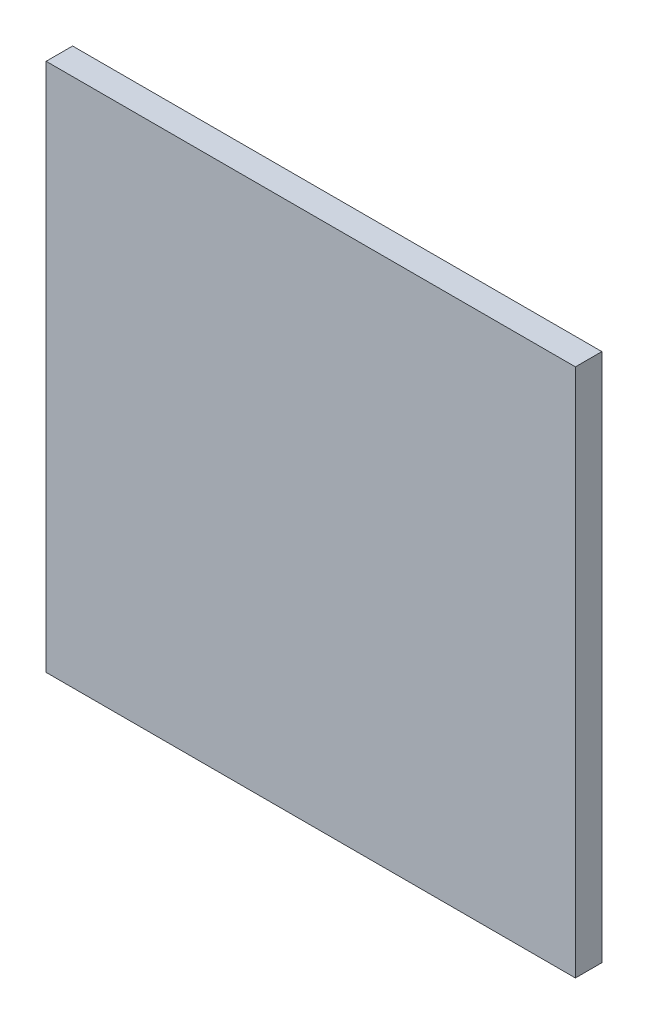
ISO-10303-21;
HEADER;
FILE_DESCRIPTION(('STEP AP214'),'2;1');
FILE_NAME('part.step','',(''),(''),'','','');
FILE_SCHEMA(('AUTOMOTIVE_DESIGN { 1 0 10303 214 1 1 1 1 }'));
ENDSEC;
DATA;
#1=APPLICATION_CONTEXT('core data for automotive mechanical design processes');
#2=APPLICATION_PROTOCOL_DEFINITION('international standard','automotive_design',2000,#1);
#3=PRODUCT_CONTEXT('',#1,'mechanical');
#4=PRODUCT('Part','Part','',(#3));
#5=PRODUCT_RELATED_PRODUCT_CATEGORY('part','',(#4));
#6=PRODUCT_DEFINITION_FORMATION('','',#4);
#7=PRODUCT_DEFINITION_CONTEXT('part definition',#1,'design');
#8=PRODUCT_DEFINITION('design','',#6,#7);
#9=PRODUCT_DEFINITION_SHAPE('','',#8);
#10=(LENGTH_UNIT() NAMED_UNIT(*) SI_UNIT(.MILLI.,.METRE.));
#11=(NAMED_UNIT(*) PLANE_ANGLE_UNIT() SI_UNIT($,.RADIAN.));
#12=(NAMED_UNIT(*) SI_UNIT($,.STERADIAN.) SOLID_ANGLE_UNIT());
#13=UNCERTAINTY_MEASURE_WITH_UNIT(LENGTH_MEASURE(1.E-05),#10,'distance_accuracy_value','');
#14=(GEOMETRIC_REPRESENTATION_CONTEXT(3) GLOBAL_UNCERTAINTY_ASSIGNED_CONTEXT((#13)) GLOBAL_UNIT_ASSIGNED_CONTEXT((#10,
#11,#12)) REPRESENTATION_CONTEXT('',''));
#15=CARTESIAN_POINT('',(0.,0.,0.));
#16=DIRECTION('',(0.,0.,1.));
#17=DIRECTION('',(1.,0.,0.));
#18=AXIS2_PLACEMENT_3D('',#15,#16,#17);
#19=CARTESIAN_POINT('',(0.,100.,5.));
#20=DIRECTION('',(1.,0.,0.));
#21=DIRECTION('',(0.,1.,0.));
#22=AXIS2_PLACEMENT_3D('',#19,#20,#21);
#23=PLANE('',#22);
#24=DIRECTION('',(0.,-1.,0.));
#25=VECTOR('',#24,1.);
#26=CARTESIAN_POINT('',(0.,100.,0.));
#27=LINE('',#26,#25);
#28=CARTESIAN_POINT('',(0.,100.,0.));
#29=VERTEX_POINT('',#28);
#30=CARTESIAN_POINT('',(0.,0.,0.));
#31=VERTEX_POINT('',#30);
#32=EDGE_CURVE('E113',#29,#31,#27,.T.);
#33=ORIENTED_EDGE('',*,*,#32,.T.);
#34=DIRECTION('',(0.,0.,-1.));
#35=VECTOR('',#34,1.);
#36=CARTESIAN_POINT('',(0.,0.,5.));
#37=LINE('',#36,#35);
#38=CARTESIAN_POINT('',(0.,0.,5.));
#39=VERTEX_POINT('',#38);
#40=EDGE_CURVE('E11',#39,#31,#37,.T.);
#41=ORIENTED_EDGE('',*,*,#40,.F.);
#42=DIRECTION('',(0.,-1.,0.));
#43=VECTOR('',#42,1.);
#44=CARTESIAN_POINT('',(0.,100.,5.));
#45=LINE('',#44,#43);
#46=CARTESIAN_POINT('',(0.,100.,5.));
#47=VERTEX_POINT('',#46);
#48=EDGE_CURVE('E97',#47,#39,#45,.T.);
#49=ORIENTED_EDGE('',*,*,#48,.F.);
#50=DIRECTION('',(0.,0.,-1.));
#51=VECTOR('',#50,1.);
#52=CARTESIAN_POINT('',(0.,100.,5.));
#53=LINE('',#52,#51);
#54=EDGE_CURVE('E109',#47,#29,#53,.T.);
#55=ORIENTED_EDGE('',*,*,#54,.T.);
#56=EDGE_LOOP('',(#33,#41,#49,#55));
#57=FACE_BOUND('',#56,.T.);
#58=ADVANCED_FACE('F45',(#57),#23,.F.);
#59=CARTESIAN_POINT('',(0.,0.,5.));
#60=DIRECTION('',(0.,1.,0.));
#61=DIRECTION('',(0.,0.,1.));
#62=AXIS2_PLACEMENT_3D('',#59,#60,#61);
#63=PLANE('',#62);
#64=DIRECTION('',(1.,0.,0.));
#65=VECTOR('',#64,1.);
#66=CARTESIAN_POINT('',(0.,0.,0.));
#67=LINE('',#66,#65);
#68=CARTESIAN_POINT('',(100.,0.,0.));
#69=VERTEX_POINT('',#68);
#70=EDGE_CURVE('E102',#31,#69,#67,.T.);
#71=ORIENTED_EDGE('',*,*,#70,.T.);
#72=DIRECTION('',(0.,0.,-1.));
#73=VECTOR('',#72,1.);
#74=CARTESIAN_POINT('',(100.,0.,5.));
#75=LINE('',#74,#73);
#76=CARTESIAN_POINT('',(100.,0.,5.));
#77=VERTEX_POINT('',#76);
#78=EDGE_CURVE('E54',#77,#69,#75,.T.);
#79=ORIENTED_EDGE('',*,*,#78,.F.);
#80=DIRECTION('',(1.,0.,0.));
#81=VECTOR('',#80,1.);
#82=CARTESIAN_POINT('',(0.,0.,5.));
#83=LINE('',#82,#81);
#84=EDGE_CURVE('E92',#39,#77,#83,.T.);
#85=ORIENTED_EDGE('',*,*,#84,.F.);
#86=ORIENTED_EDGE('',*,*,#40,.T.);
#87=EDGE_LOOP('',(#71,#79,#85,#86));
#88=FACE_BOUND('',#87,.T.);
#89=ADVANCED_FACE('F101',(#88),#63,.F.);
#90=CARTESIAN_POINT('',(100.,100.,5.));
#91=DIRECTION('',(-1.,0.,0.));
#92=DIRECTION('',(0.,-1.,0.));
#93=AXIS2_PLACEMENT_3D('',#90,#91,#92);
#94=PLANE('',#93);
#95=DIRECTION('',(0.,1.,0.));
#96=VECTOR('',#95,1.);
#97=CARTESIAN_POINT('',(100.,100.,0.));
#98=LINE('',#97,#96);
#99=CARTESIAN_POINT('',(100.,100.,0.));
#100=VERTEX_POINT('',#99);
#101=EDGE_CURVE('E79',#69,#100,#98,.T.);
#102=ORIENTED_EDGE('',*,*,#101,.T.);
#103=DIRECTION('',(0.,0.,-1.));
#104=VECTOR('',#103,1.);
#105=CARTESIAN_POINT('',(100.,100.,5.));
#106=LINE('',#105,#104);
#107=CARTESIAN_POINT('',(100.,100.,5.));
#108=VERTEX_POINT('',#107);
#109=EDGE_CURVE('E104',#108,#100,#106,.T.);
#110=ORIENTED_EDGE('',*,*,#109,.F.);
#111=DIRECTION('',(0.,1.,0.));
#112=VECTOR('',#111,1.);
#113=CARTESIAN_POINT('',(100.,100.,5.));
#114=LINE('',#113,#112);
#115=EDGE_CURVE('E95',#77,#108,#114,.T.);
#116=ORIENTED_EDGE('',*,*,#115,.F.);
#117=ORIENTED_EDGE('',*,*,#78,.T.);
#118=EDGE_LOOP('',(#102,#110,#116,#117));
#119=FACE_BOUND('',#118,.T.);
#120=ADVANCED_FACE('F105',(#119),#94,.F.);
#121=CARTESIAN_POINT('',(0.,100.,5.));
#122=DIRECTION('',(0.,-1.,0.));
#123=DIRECTION('',(0.,0.,-1.));
#124=AXIS2_PLACEMENT_3D('',#121,#122,#123);
#125=PLANE('',#124);
#126=DIRECTION('',(-1.,0.,0.));
#127=VECTOR('',#126,1.);
#128=CARTESIAN_POINT('',(0.,100.,0.));
#129=LINE('',#128,#127);
#130=EDGE_CURVE('E85',#100,#29,#129,.T.);
#131=ORIENTED_EDGE('',*,*,#130,.T.);
#132=ORIENTED_EDGE('',*,*,#54,.F.);
#133=DIRECTION('',(-1.,0.,0.));
#134=VECTOR('',#133,1.);
#135=CARTESIAN_POINT('',(0.,100.,5.));
#136=LINE('',#135,#134);
#137=EDGE_CURVE('E62',#108,#47,#136,.T.);
#138=ORIENTED_EDGE('',*,*,#137,.F.);
#139=ORIENTED_EDGE('',*,*,#109,.T.);
#140=EDGE_LOOP('',(#131,#132,#138,#139));
#141=FACE_BOUND('',#140,.T.);
#142=ADVANCED_FACE('F126',(#141),#125,.F.);
#143=CARTESIAN_POINT('',(0.,0.,5.));
#144=DIRECTION('',(0.,0.,1.));
#145=DIRECTION('',(1.,0.,0.));
#146=AXIS2_PLACEMENT_3D('',#143,#144,#145);
#147=PLANE('',#146);
#148=ORIENTED_EDGE('',*,*,#48,.T.);
#149=ORIENTED_EDGE('',*,*,#84,.T.);
#150=ORIENTED_EDGE('',*,*,#115,.T.);
#151=ORIENTED_EDGE('',*,*,#137,.T.);
#152=EDGE_LOOP('',(#148,#149,#150,#151));
#153=FACE_BOUND('',#152,.T.);
#154=ADVANCED_FACE('F93',(#153),#147,.T.);
#155=CARTESIAN_POINT('',(0.,0.,0.));
#156=DIRECTION('',(0.,0.,1.));
#157=DIRECTION('',(1.,0.,0.));
#158=AXIS2_PLACEMENT_3D('',#155,#156,#157);
#159=PLANE('',#158);
#160=ORIENTED_EDGE('',*,*,#32,.F.);
#161=ORIENTED_EDGE('',*,*,#130,.F.);
#162=ORIENTED_EDGE('',*,*,#101,.F.);
#163=ORIENTED_EDGE('',*,*,#70,.F.);
#164=EDGE_LOOP('',(#160,#161,#162,#163));
#165=FACE_BOUND('',#164,.T.);
#166=ADVANCED_FACE('F129',(#165),#159,.F.);
#167=CLOSED_SHELL('',(#58,#89,#120,#142,#154,#166));
#168=MANIFOLD_SOLID_BREP('B2',#167);
#169=ADVANCED_BREP_SHAPE_REPRESENTATION('',(#18,#168),#14);
#170=SHAPE_DEFINITION_REPRESENTATION(#9,#169);
ENDSEC;
END-ISO-10303-21;
